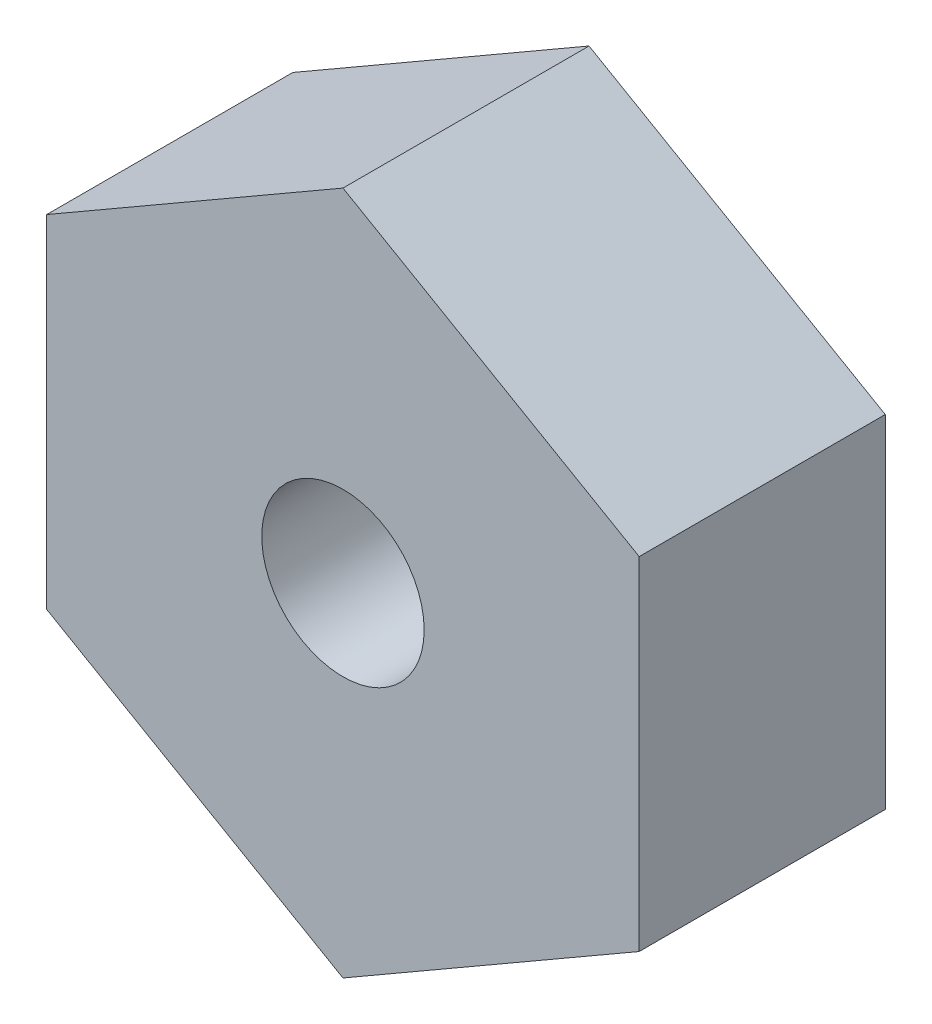
ISO-10303-21;
HEADER;
FILE_DESCRIPTION(('STEP AP214'),'2;1');
FILE_NAME('part.step','',(''),(''),'','','');
FILE_SCHEMA(('AUTOMOTIVE_DESIGN { 1 0 10303 214 1 1 1 1 }'));
ENDSEC;
DATA;
#1=APPLICATION_CONTEXT('core data for automotive mechanical design processes');
#2=APPLICATION_PROTOCOL_DEFINITION('international standard','automotive_design',2000,#1);
#3=PRODUCT_CONTEXT('',#1,'mechanical');
#4=PRODUCT('Part','Part','',(#3));
#5=PRODUCT_RELATED_PRODUCT_CATEGORY('part','',(#4));
#6=PRODUCT_DEFINITION_FORMATION('','',#4);
#7=PRODUCT_DEFINITION_CONTEXT('part definition',#1,'design');
#8=PRODUCT_DEFINITION('design','',#6,#7);
#9=PRODUCT_DEFINITION_SHAPE('','',#8);
#10=(LENGTH_UNIT() NAMED_UNIT(*) SI_UNIT(.MILLI.,.METRE.));
#11=(NAMED_UNIT(*) PLANE_ANGLE_UNIT() SI_UNIT($,.RADIAN.));
#12=(NAMED_UNIT(*) SI_UNIT($,.STERADIAN.) SOLID_ANGLE_UNIT());
#13=UNCERTAINTY_MEASURE_WITH_UNIT(LENGTH_MEASURE(1.E-05),#10,'distance_accuracy_value','');
#14=(GEOMETRIC_REPRESENTATION_CONTEXT(3) GLOBAL_UNCERTAINTY_ASSIGNED_CONTEXT((#13)) GLOBAL_UNIT_ASSIGNED_CONTEXT((#10,
#11,#12)) REPRESENTATION_CONTEXT('',''));
#15=CARTESIAN_POINT('',(0.,0.,0.));
#16=DIRECTION('',(0.,0.,1.));
#17=DIRECTION('',(1.,0.,0.));
#18=AXIS2_PLACEMENT_3D('',#15,#16,#17);
#19=CARTESIAN_POINT('',(-6.01887655630181,-3.47500000000007,5.));
#20=DIRECTION('',(0.499999999999995,0.866025403784441,0.));
#21=DIRECTION('',(-0.866025403784441,0.499999999999995,0.));
#22=AXIS2_PLACEMENT_3D('',#19,#20,#21);
#23=PLANE('',#22);
#24=DIRECTION('',(0.866025403784441,-0.499999999999995,0.));
#25=VECTOR('',#24,1.);
#26=CARTESIAN_POINT('',(-6.01887655630181,-3.47500000000007,0.));
#27=LINE('',#26,#25);
#28=CARTESIAN_POINT('',(-6.01887655630181,-3.47500000000007,0.));
#29=VERTEX_POINT('',#28);
#30=CARTESIAN_POINT('',(0.,-6.95,0.));
#31=VERTEX_POINT('',#30);
#32=EDGE_CURVE('E128',#29,#31,#27,.T.);
#33=ORIENTED_EDGE('',*,*,#32,.T.);
#34=DIRECTION('',(0.,0.,-1.));
#35=VECTOR('',#34,1.);
#36=CARTESIAN_POINT('',(0.,-6.95,5.));
#37=LINE('',#36,#35);
#38=CARTESIAN_POINT('',(0.,-6.95,5.));
#39=VERTEX_POINT('',#38);
#40=EDGE_CURVE('E11',#39,#31,#37,.T.);
#41=ORIENTED_EDGE('',*,*,#40,.F.);
#42=DIRECTION('',(0.866025403784441,-0.499999999999995,0.));
#43=VECTOR('',#42,1.);
#44=CARTESIAN_POINT('',(-6.01887655630181,-3.47500000000007,5.));
#45=LINE('',#44,#43);
#46=CARTESIAN_POINT('',(-6.01887655630181,-3.47500000000007,5.));
#47=VERTEX_POINT('',#46);
#48=EDGE_CURVE('E144',#47,#39,#45,.T.);
#49=ORIENTED_EDGE('',*,*,#48,.F.);
#50=DIRECTION('',(0.,0.,-1.));
#51=VECTOR('',#50,1.);
#52=CARTESIAN_POINT('',(-6.01887655630181,-3.47500000000007,5.));
#53=LINE('',#52,#51);
#54=EDGE_CURVE('E124',#47,#29,#53,.T.);
#55=ORIENTED_EDGE('',*,*,#54,.T.);
#56=EDGE_LOOP('',(#33,#41,#49,#55));
#57=FACE_BOUND('',#56,.T.);
#58=ADVANCED_FACE('F38',(#57),#23,.F.);
#59=CARTESIAN_POINT('',(0.,-6.95,5.));
#60=DIRECTION('',(-0.500000000000001,0.866025403784438,0.));
#61=DIRECTION('',(-0.866025403784438,-0.500000000000001,0.));
#62=AXIS2_PLACEMENT_3D('',#59,#60,#61);
#63=PLANE('',#62);
#64=DIRECTION('',(0.866025403784438,0.500000000000001,0.));
#65=VECTOR('',#64,1.);
#66=CARTESIAN_POINT('',(0.,-6.95,0.));
#67=LINE('',#66,#65);
#68=CARTESIAN_POINT('',(6.01887655630186,-3.47499999999999,0.));
#69=VERTEX_POINT('',#68);
#70=EDGE_CURVE('E132',#31,#69,#67,.T.);
#71=ORIENTED_EDGE('',*,*,#70,.T.);
#72=DIRECTION('',(0.,0.,-1.));
#73=VECTOR('',#72,1.);
#74=CARTESIAN_POINT('',(6.01887655630186,-3.47499999999999,5.));
#75=LINE('',#74,#73);
#76=CARTESIAN_POINT('',(6.01887655630186,-3.47499999999999,5.));
#77=VERTEX_POINT('',#76);
#78=EDGE_CURVE('E48',#77,#69,#75,.T.);
#79=ORIENTED_EDGE('',*,*,#78,.F.);
#80=DIRECTION('',(0.866025403784438,0.500000000000001,0.));
#81=VECTOR('',#80,1.);
#82=CARTESIAN_POINT('',(0.,-6.95,5.));
#83=LINE('',#82,#81);
#84=EDGE_CURVE('E93',#39,#77,#83,.T.);
#85=ORIENTED_EDGE('',*,*,#84,.F.);
#86=ORIENTED_EDGE('',*,*,#40,.T.);
#87=EDGE_LOOP('',(#71,#79,#85,#86));
#88=FACE_BOUND('',#87,.T.);
#89=ADVANCED_FACE('F175',(#88),#63,.F.);
#90=CARTESIAN_POINT('',(6.01887655630186,-3.47499999999999,5.));
#91=DIRECTION('',(-1.,0.,0.));
#92=DIRECTION('',(0.,-1.,0.));
#93=AXIS2_PLACEMENT_3D('',#90,#91,#92);
#94=PLANE('',#93);
#95=DIRECTION('',(0.,1.,0.));
#96=VECTOR('',#95,1.);
#97=CARTESIAN_POINT('',(6.01887655630186,-3.47499999999999,0.));
#98=LINE('',#97,#96);
#99=CARTESIAN_POINT('',(6.01887655630183,3.47500000000003,0.));
#100=VERTEX_POINT('',#99);
#101=EDGE_CURVE('E135',#69,#100,#98,.T.);
#102=ORIENTED_EDGE('',*,*,#101,.T.);
#103=DIRECTION('',(0.,0.,-1.));
#104=VECTOR('',#103,1.);
#105=CARTESIAN_POINT('',(6.01887655630183,3.47500000000003,5.));
#106=LINE('',#105,#104);
#107=CARTESIAN_POINT('',(6.01887655630183,3.47500000000003,5.));
#108=VERTEX_POINT('',#107);
#109=EDGE_CURVE('E117',#108,#100,#106,.T.);
#110=ORIENTED_EDGE('',*,*,#109,.F.);
#111=DIRECTION('',(0.,1.,0.));
#112=VECTOR('',#111,1.);
#113=CARTESIAN_POINT('',(6.01887655630186,-3.47499999999999,5.));
#114=LINE('',#113,#112);
#115=EDGE_CURVE('E106',#77,#108,#114,.T.);
#116=ORIENTED_EDGE('',*,*,#115,.F.);
#117=ORIENTED_EDGE('',*,*,#78,.T.);
#118=EDGE_LOOP('',(#102,#110,#116,#117));
#119=FACE_BOUND('',#118,.T.);
#120=ADVANCED_FACE('F155',(#119),#94,.F.);
#121=CARTESIAN_POINT('',(6.01887655630183,3.47500000000003,5.));
#122=DIRECTION('',(-0.499999999999995,-0.866025403784442,0.));
#123=DIRECTION('',(0.866025403784442,-0.499999999999995,0.));
#124=AXIS2_PLACEMENT_3D('',#121,#122,#123);
#125=PLANE('',#124);
#126=DIRECTION('',(-0.866025403784442,0.499999999999995,0.));
#127=VECTOR('',#126,1.);
#128=CARTESIAN_POINT('',(6.01887655630183,3.47500000000003,0.));
#129=LINE('',#128,#127);
#130=CARTESIAN_POINT('',(0.,6.95,0.));
#131=VERTEX_POINT('',#130);
#132=EDGE_CURVE('E115',#100,#131,#129,.T.);
#133=ORIENTED_EDGE('',*,*,#132,.T.);
#134=DIRECTION('',(0.,0.,-1.));
#135=VECTOR('',#134,1.);
#136=CARTESIAN_POINT('',(0.,6.95,5.));
#137=LINE('',#136,#135);
#138=CARTESIAN_POINT('',(0.,6.95,5.));
#139=VERTEX_POINT('',#138);
#140=EDGE_CURVE('E112',#139,#131,#137,.T.);
#141=ORIENTED_EDGE('',*,*,#140,.F.);
#142=DIRECTION('',(-0.866025403784442,0.499999999999995,0.));
#143=VECTOR('',#142,1.);
#144=CARTESIAN_POINT('',(6.01887655630183,3.47500000000003,5.));
#145=LINE('',#144,#143);
#146=EDGE_CURVE('E100',#108,#139,#145,.T.);
#147=ORIENTED_EDGE('',*,*,#146,.F.);
#148=ORIENTED_EDGE('',*,*,#109,.T.);
#149=EDGE_LOOP('',(#133,#141,#147,#148));
#150=FACE_BOUND('',#149,.T.);
#151=ADVANCED_FACE('F113',(#150),#125,.F.);
#152=CARTESIAN_POINT('',(0.,6.95,5.));
#153=DIRECTION('',(0.500000000000007,-0.866025403784435,0.));
#154=DIRECTION('',(0.866025403784435,0.500000000000007,0.));
#155=AXIS2_PLACEMENT_3D('',#152,#153,#154);
#156=PLANE('',#155);
#157=DIRECTION('',(-0.866025403784434,-0.500000000000007,0.));
#158=VECTOR('',#157,1.);
#159=CARTESIAN_POINT('',(0.,6.95,0.));
#160=LINE('',#159,#158);
#161=CARTESIAN_POINT('',(-6.01887655630188,3.47499999999994,0.));
#162=VERTEX_POINT('',#161);
#163=EDGE_CURVE('E79',#131,#162,#160,.T.);
#164=ORIENTED_EDGE('',*,*,#163,.T.);
#165=DIRECTION('',(0.,0.,-1.));
#166=VECTOR('',#165,1.);
#167=CARTESIAN_POINT('',(-6.01887655630188,3.47499999999994,5.));
#168=LINE('',#167,#166);
#169=CARTESIAN_POINT('',(-6.01887655630188,3.47499999999994,5.));
#170=VERTEX_POINT('',#169);
#171=EDGE_CURVE('E118',#170,#162,#168,.T.);
#172=ORIENTED_EDGE('',*,*,#171,.F.);
#173=DIRECTION('',(-0.866025403784434,-0.500000000000007,0.));
#174=VECTOR('',#173,1.);
#175=CARTESIAN_POINT('',(0.,6.95,5.));
#176=LINE('',#175,#174);
#177=EDGE_CURVE('E104',#139,#170,#176,.T.);
#178=ORIENTED_EDGE('',*,*,#177,.F.);
#179=ORIENTED_EDGE('',*,*,#140,.T.);
#180=EDGE_LOOP('',(#164,#172,#178,#179));
#181=FACE_BOUND('',#180,.T.);
#182=ADVANCED_FACE('F120',(#181),#156,.F.);
#183=CARTESIAN_POINT('',(-6.01887655630188,3.47499999999994,5.));
#184=DIRECTION('',(1.,0.,0.));
#185=DIRECTION('',(0.,1.,0.));
#186=AXIS2_PLACEMENT_3D('',#183,#184,#185);
#187=PLANE('',#186);
#188=DIRECTION('',(0.,-1.,0.));
#189=VECTOR('',#188,1.);
#190=CARTESIAN_POINT('',(-6.01887655630188,3.47499999999994,0.));
#191=LINE('',#190,#189);
#192=EDGE_CURVE('E85',#162,#29,#191,.T.);
#193=ORIENTED_EDGE('',*,*,#192,.T.);
#194=ORIENTED_EDGE('',*,*,#54,.F.);
#195=DIRECTION('',(0.,-1.,0.));
#196=VECTOR('',#195,1.);
#197=CARTESIAN_POINT('',(-6.01887655630188,3.47499999999994,5.));
#198=LINE('',#197,#196);
#199=EDGE_CURVE('E56',#170,#47,#198,.T.);
#200=ORIENTED_EDGE('',*,*,#199,.F.);
#201=ORIENTED_EDGE('',*,*,#171,.T.);
#202=EDGE_LOOP('',(#193,#194,#200,#201));
#203=FACE_BOUND('',#202,.T.);
#204=ADVANCED_FACE('F162',(#203),#187,.F.);
#205=CARTESIAN_POINT('',(0.,0.,5.));
#206=DIRECTION('',(0.,0.,1.));
#207=DIRECTION('',(1.,0.,0.));
#208=AXIS2_PLACEMENT_3D('',#205,#206,#207);
#209=PLANE('',#208);
#210=CARTESIAN_POINT('',(0.,0.,5.));
#211=DIRECTION('',(0.,0.,1.));
#212=DIRECTION('',(1.,0.,0.));
#213=AXIS2_PLACEMENT_3D('',#210,#211,#212);
#214=CIRCLE('',#213,1.65);
#215=CARTESIAN_POINT('',(1.65,0.,5.));
#216=VERTEX_POINT('',#215);
#217=EDGE_CURVE('E227',#216,#216,#214,.T.);
#218=ORIENTED_EDGE('',*,*,#217,.F.);
#219=EDGE_LOOP('',(#218));
#220=FACE_BOUND('',#219,.T.);
#221=ORIENTED_EDGE('',*,*,#48,.T.);
#222=ORIENTED_EDGE('',*,*,#84,.T.);
#223=ORIENTED_EDGE('',*,*,#115,.T.);
#224=ORIENTED_EDGE('',*,*,#146,.T.);
#225=ORIENTED_EDGE('',*,*,#177,.T.);
#226=ORIENTED_EDGE('',*,*,#199,.T.);
#227=EDGE_LOOP('',(#221,#222,#223,#224,#225,#226));
#228=FACE_BOUND('',#227,.T.);
#229=ADVANCED_FACE('F102',(#220,#228),#209,.T.);
#230=CARTESIAN_POINT('',(0.,0.,0.));
#231=DIRECTION('',(0.,0.,1.));
#232=DIRECTION('',(1.,0.,0.));
#233=AXIS2_PLACEMENT_3D('',#230,#231,#232);
#234=PLANE('',#233);
#235=CARTESIAN_POINT('',(0.,0.,0.));
#236=DIRECTION('',(0.,0.,1.));
#237=DIRECTION('',(1.,0.,0.));
#238=AXIS2_PLACEMENT_3D('',#235,#236,#237);
#239=CIRCLE('',#238,1.65);
#240=CARTESIAN_POINT('',(1.65,0.,0.));
#241=VERTEX_POINT('',#240);
#242=EDGE_CURVE('E41',#241,#241,#239,.T.);
#243=ORIENTED_EDGE('',*,*,#242,.T.);
#244=EDGE_LOOP('',(#243));
#245=FACE_BOUND('',#244,.T.);
#246=ORIENTED_EDGE('',*,*,#32,.F.);
#247=ORIENTED_EDGE('',*,*,#192,.F.);
#248=ORIENTED_EDGE('',*,*,#163,.F.);
#249=ORIENTED_EDGE('',*,*,#132,.F.);
#250=ORIENTED_EDGE('',*,*,#101,.F.);
#251=ORIENTED_EDGE('',*,*,#70,.F.);
#252=EDGE_LOOP('',(#246,#247,#248,#249,#250,#251));
#253=FACE_BOUND('',#252,.T.);
#254=ADVANCED_FACE('F158',(#245,#253),#234,.F.);
#255=CARTESIAN_POINT('',(0.,0.,-5.));
#256=DIRECTION('',(0.,0.,1.));
#257=DIRECTION('',(1.,0.,0.));
#258=AXIS2_PLACEMENT_3D('',#255,#256,#257);
#259=CYLINDRICAL_SURFACE('',#258,1.65);
#260=ORIENTED_EDGE('',*,*,#217,.T.);
#261=EDGE_LOOP('',(#260));
#262=FACE_BOUND('',#261,.T.);
#263=ORIENTED_EDGE('',*,*,#242,.F.);
#264=EDGE_LOOP('',(#263));
#265=FACE_BOUND('',#264,.T.);
#266=ADVANCED_FACE('F208',(#262,#265),#259,.F.);
#267=CLOSED_SHELL('',(#58,#89,#120,#151,#182,#204,#229,#254,#266));
#268=MANIFOLD_SOLID_BREP('B2',#267);
#269=ADVANCED_BREP_SHAPE_REPRESENTATION('',(#18,#268),#14);
#270=SHAPE_DEFINITION_REPRESENTATION(#9,#269);
ENDSEC;
END-ISO-10303-21;
